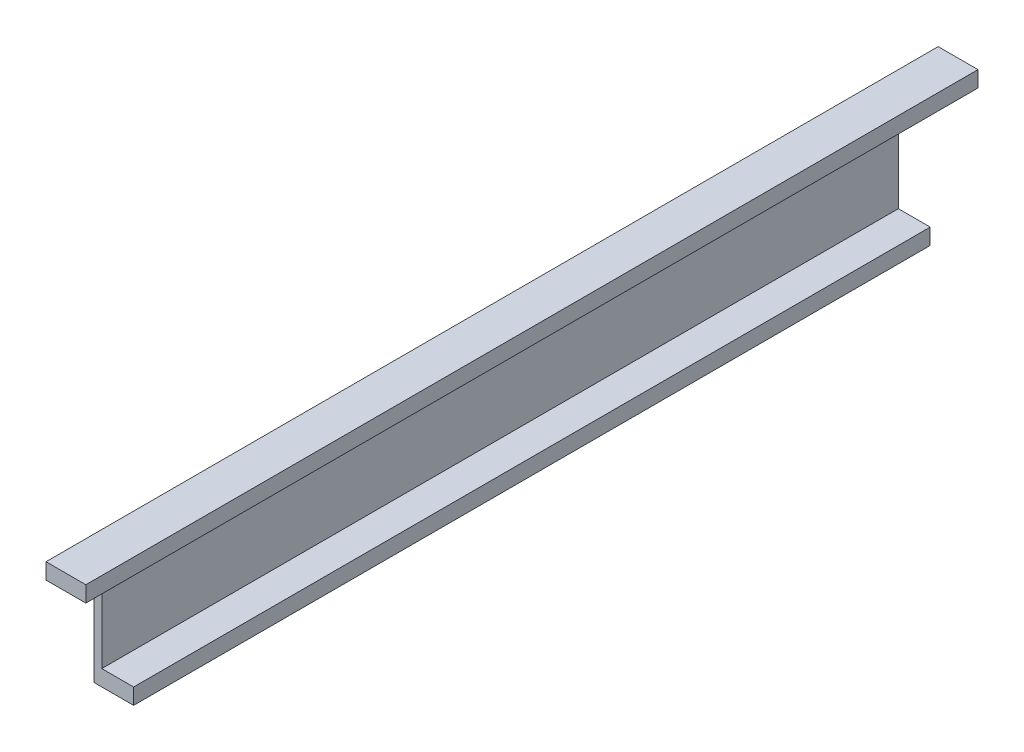
ISO-10303-21;
HEADER;
FILE_DESCRIPTION(('STEP AP214'),'2;1');
FILE_NAME('part.step','',(''),(''),'','','');
FILE_SCHEMA(('AUTOMOTIVE_DESIGN { 1 0 10303 214 1 1 1 1 }'));
ENDSEC;
DATA;
#1=APPLICATION_CONTEXT('core data for automotive mechanical design processes');
#2=APPLICATION_PROTOCOL_DEFINITION('international standard','automotive_design',2000,#1);
#3=PRODUCT_CONTEXT('',#1,'mechanical');
#4=PRODUCT('Part','Part','',(#3));
#5=PRODUCT_RELATED_PRODUCT_CATEGORY('part','',(#4));
#6=PRODUCT_DEFINITION_FORMATION('','',#4);
#7=PRODUCT_DEFINITION_CONTEXT('part definition',#1,'design');
#8=PRODUCT_DEFINITION('design','',#6,#7);
#9=PRODUCT_DEFINITION_SHAPE('','',#8);
#10=(LENGTH_UNIT() NAMED_UNIT(*) SI_UNIT(.MILLI.,.METRE.));
#11=(NAMED_UNIT(*) PLANE_ANGLE_UNIT() SI_UNIT($,.RADIAN.));
#12=(NAMED_UNIT(*) SI_UNIT($,.STERADIAN.) SOLID_ANGLE_UNIT());
#13=UNCERTAINTY_MEASURE_WITH_UNIT(LENGTH_MEASURE(1.E-05),#10,'distance_accuracy_value','');
#14=(GEOMETRIC_REPRESENTATION_CONTEXT(3) GLOBAL_UNCERTAINTY_ASSIGNED_CONTEXT((#13)) GLOBAL_UNIT_ASSIGNED_CONTEXT((#10,
#11,#12)) REPRESENTATION_CONTEXT('',''));
#15=CARTESIAN_POINT('',(0.,0.,0.));
#16=DIRECTION('',(0.,0.,1.));
#17=DIRECTION('',(1.,0.,0.));
#18=AXIS2_PLACEMENT_3D('',#15,#16,#17);
#19=CARTESIAN_POINT('',(1.25,-2.49999999999998,-125.));
#20=DIRECTION('',(0.,1.,0.));
#21=DIRECTION('',(0.,0.,1.));
#22=AXIS2_PLACEMENT_3D('',#19,#20,#21);
#23=PLANE('',#22);
#24=DIRECTION('',(-1.,0.,0.));
#25=VECTOR('',#24,1.);
#26=CARTESIAN_POINT('',(1.25,-2.49999999999998,-125.));
#27=LINE('',#26,#25);
#28=CARTESIAN_POINT('',(8.75,-2.49999999999998,-125.));
#29=VERTEX_POINT('',#28);
#30=CARTESIAN_POINT('',(-3.75,-2.49999999999998,-125.));
#31=VERTEX_POINT('',#30);
#32=EDGE_CURVE('E56',#29,#31,#27,.T.);
#33=ORIENTED_EDGE('',*,*,#32,.F.);
#34=DIRECTION('',(0.,0.,-1.));
#35=VECTOR('',#34,1.);
#36=CARTESIAN_POINT('',(8.75,-2.50000000000002,125.));
#37=LINE('',#36,#35);
#38=CARTESIAN_POINT('',(8.75,-2.50000000000002,125.));
#39=VERTEX_POINT('',#38);
#40=EDGE_CURVE('E148',#39,#29,#37,.T.);
#41=ORIENTED_EDGE('',*,*,#40,.F.);
#42=DIRECTION('',(1.,0.,0.));
#43=VECTOR('',#42,1.);
#44=CARTESIAN_POINT('',(-3.75,-2.49999999999998,125.));
#45=LINE('',#44,#43);
#46=CARTESIAN_POINT('',(-3.75,-2.49999999999998,125.));
#47=VERTEX_POINT('',#46);
#48=EDGE_CURVE('E189',#47,#39,#45,.T.);
#49=ORIENTED_EDGE('',*,*,#48,.F.);
#50=DIRECTION('',(0.,0.,-1.));
#51=VECTOR('',#50,1.);
#52=CARTESIAN_POINT('',(-3.75,-2.49999999999998,75.0000000000001));
#53=LINE('',#52,#51);
#54=EDGE_CURVE('E198',#47,#31,#53,.T.);
#55=ORIENTED_EDGE('',*,*,#54,.T.);
#56=EDGE_LOOP('',(#33,#41,#49,#55));
#57=FACE_BOUND('',#56,.T.);
#58=ADVANCED_FACE('F49',(#57),#23,.F.);
#59=CARTESIAN_POINT('',(1.25,2.50000000000002,-125.));
#60=DIRECTION('',(0.,-1.,0.));
#61=DIRECTION('',(0.,0.,-1.));
#62=AXIS2_PLACEMENT_3D('',#59,#60,#61);
#63=PLANE('',#62);
#64=DIRECTION('',(0.,0.,1.));
#65=VECTOR('',#64,1.);
#66=CARTESIAN_POINT('',(-1.25,2.50000000000002,-125.));
#67=LINE('',#66,#65);
#68=CARTESIAN_POINT('',(-1.25,2.50000000000002,-125.));
#69=VERTEX_POINT('',#68);
#70=CARTESIAN_POINT('',(-1.25,2.49999999999999,125.));
#71=VERTEX_POINT('',#70);
#72=EDGE_CURVE('E69',#69,#71,#67,.T.);
#73=ORIENTED_EDGE('',*,*,#72,.T.);
#74=DIRECTION('',(-1.,0.,0.));
#75=VECTOR('',#74,1.);
#76=CARTESIAN_POINT('',(1.25,2.49999999999999,125.));
#77=LINE('',#76,#75);
#78=CARTESIAN_POINT('',(8.75,2.49999999999999,125.));
#79=VERTEX_POINT('',#78);
#80=EDGE_CURVE('E139',#79,#71,#77,.T.);
#81=ORIENTED_EDGE('',*,*,#80,.F.);
#82=DIRECTION('',(0.,0.,1.));
#83=VECTOR('',#82,1.);
#84=CARTESIAN_POINT('',(8.75,2.50000000000002,-125.));
#85=LINE('',#84,#83);
#86=CARTESIAN_POINT('',(8.75,2.50000000000002,-125.));
#87=VERTEX_POINT('',#86);
#88=EDGE_CURVE('E136',#87,#79,#85,.T.);
#89=ORIENTED_EDGE('',*,*,#88,.F.);
#90=DIRECTION('',(-1.,0.,0.));
#91=VECTOR('',#90,1.);
#92=CARTESIAN_POINT('',(1.25,2.50000000000002,-125.));
#93=LINE('',#92,#91);
#94=EDGE_CURVE('E125',#87,#69,#93,.T.);
#95=ORIENTED_EDGE('',*,*,#94,.T.);
#96=EDGE_LOOP('',(#73,#81,#89,#95));
#97=FACE_BOUND('',#96,.T.);
#98=ADVANCED_FACE('F137',(#97),#63,.F.);
#99=CARTESIAN_POINT('',(1.25,-2.49999999999998,-125.));
#100=DIRECTION('',(0.,0.,1.));
#101=DIRECTION('',(1.,0.,0.));
#102=AXIS2_PLACEMENT_3D('',#99,#100,#101);
#103=PLANE('',#102);
#104=DIRECTION('',(0.,-1.,0.));
#105=VECTOR('',#104,1.);
#106=CARTESIAN_POINT('',(-3.75,0.,-125.));
#107=LINE('',#106,#105);
#108=CARTESIAN_POINT('',(-3.75,32.8,-125.));
#109=VERTEX_POINT('',#108);
#110=EDGE_CURVE('E194',#109,#31,#107,.T.);
#111=ORIENTED_EDGE('',*,*,#110,.F.);
#112=DIRECTION('',(1.,0.,0.));
#113=VECTOR('',#112,1.);
#114=CARTESIAN_POINT('',(1.25,32.8,-125.));
#115=LINE('',#114,#113);
#116=CARTESIAN_POINT('',(-1.25,32.8,-125.));
#117=VERTEX_POINT('',#116);
#118=EDGE_CURVE('E185',#109,#117,#115,.T.);
#119=ORIENTED_EDGE('',*,*,#118,.T.);
#120=DIRECTION('',(0.,1.,0.));
#121=VECTOR('',#120,1.);
#122=CARTESIAN_POINT('',(-1.25,0.,-125.));
#123=LINE('',#122,#121);
#124=EDGE_CURVE('E132',#69,#117,#123,.T.);
#125=ORIENTED_EDGE('',*,*,#124,.F.);
#126=ORIENTED_EDGE('',*,*,#94,.F.);
#127=DIRECTION('',(0.,1.,0.));
#128=VECTOR('',#127,1.);
#129=CARTESIAN_POINT('',(8.75,-2.49999999999998,-125.));
#130=LINE('',#129,#128);
#131=EDGE_CURVE('E131',#29,#87,#130,.T.);
#132=ORIENTED_EDGE('',*,*,#131,.F.);
#133=ORIENTED_EDGE('',*,*,#32,.T.);
#134=EDGE_LOOP('',(#111,#119,#125,#126,#132,#133));
#135=FACE_BOUND('',#134,.T.);
#136=ADVANCED_FACE('F128',(#135),#103,.F.);
#137=CARTESIAN_POINT('',(-1.25,0.,75.0000000000001));
#138=DIRECTION('',(-1.,0.,0.));
#139=DIRECTION('',(0.,0.,1.));
#140=AXIS2_PLACEMENT_3D('',#137,#138,#139);
#141=PLANE('',#140);
#142=DIRECTION('',(0.,0.,-1.));
#143=VECTOR('',#142,1.);
#144=CARTESIAN_POINT('',(-1.25,32.8,75.0000000000001));
#145=LINE('',#144,#143);
#146=CARTESIAN_POINT('',(-1.25,32.8,125.));
#147=VERTEX_POINT('',#146);
#148=EDGE_CURVE('E201',#147,#117,#145,.T.);
#149=ORIENTED_EDGE('',*,*,#148,.F.);
#150=DIRECTION('',(0.,1.,0.));
#151=VECTOR('',#150,1.);
#152=CARTESIAN_POINT('',(-1.25,2.49999999999999,125.));
#153=LINE('',#152,#151);
#154=EDGE_CURVE('E192',#71,#147,#153,.T.);
#155=ORIENTED_EDGE('',*,*,#154,.F.);
#156=ORIENTED_EDGE('',*,*,#72,.F.);
#157=ORIENTED_EDGE('',*,*,#124,.T.);
#158=EDGE_LOOP('',(#149,#155,#156,#157));
#159=FACE_BOUND('',#158,.T.);
#160=ADVANCED_FACE('F229',(#159),#141,.F.);
#161=CARTESIAN_POINT('',(-3.75,0.,75.0000000000001));
#162=DIRECTION('',(1.,0.,0.));
#163=DIRECTION('',(0.,1.,0.));
#164=AXIS2_PLACEMENT_3D('',#161,#162,#163);
#165=PLANE('',#164);
#166=DIRECTION('',(0.,-1.,0.));
#167=VECTOR('',#166,1.);
#168=CARTESIAN_POINT('',(-3.74999999999999,37.8,125.));
#169=LINE('',#168,#167);
#170=CARTESIAN_POINT('',(-3.75,32.8,125.));
#171=VERTEX_POINT('',#170);
#172=EDGE_CURVE('E187',#171,#47,#169,.T.);
#173=ORIENTED_EDGE('',*,*,#172,.F.);
#174=DIRECTION('',(0.,0.,1.));
#175=VECTOR('',#174,1.);
#176=CARTESIAN_POINT('',(-3.75,32.8,-140.));
#177=LINE('',#176,#175);
#178=CARTESIAN_POINT('',(-3.75,32.8,140.));
#179=VERTEX_POINT('',#178);
#180=EDGE_CURVE('E181',#171,#179,#177,.T.);
#181=ORIENTED_EDGE('',*,*,#180,.T.);
#182=DIRECTION('',(0.,-1.,0.));
#183=VECTOR('',#182,1.);
#184=CARTESIAN_POINT('',(-3.74999999999999,37.8,140.));
#185=LINE('',#184,#183);
#186=CARTESIAN_POINT('',(-3.74999999999999,37.8,140.));
#187=VERTEX_POINT('',#186);
#188=EDGE_CURVE('E170',#187,#179,#185,.T.);
#189=ORIENTED_EDGE('',*,*,#188,.F.);
#190=DIRECTION('',(0.,0.,-1.));
#191=VECTOR('',#190,1.);
#192=CARTESIAN_POINT('',(-3.74999999999999,37.8,75.0000000000001));
#193=LINE('',#192,#191);
#194=CARTESIAN_POINT('',(-3.74999999999999,37.8,-140.));
#195=VERTEX_POINT('',#194);
#196=EDGE_CURVE('E197',#187,#195,#193,.T.);
#197=ORIENTED_EDGE('',*,*,#196,.T.);
#198=DIRECTION('',(0.,-1.,0.));
#199=VECTOR('',#198,1.);
#200=CARTESIAN_POINT('',(-3.74999999999999,37.8,-140.));
#201=LINE('',#200,#199);
#202=CARTESIAN_POINT('',(-3.75,32.8,-140.));
#203=VERTEX_POINT('',#202);
#204=EDGE_CURVE('E178',#195,#203,#201,.T.);
#205=ORIENTED_EDGE('',*,*,#204,.T.);
#206=EDGE_CURVE('E182',#203,#109,#177,.T.);
#207=ORIENTED_EDGE('',*,*,#206,.T.);
#208=ORIENTED_EDGE('',*,*,#110,.T.);
#209=ORIENTED_EDGE('',*,*,#54,.F.);
#210=EDGE_LOOP('',(#173,#181,#189,#197,#205,#207,#208,#209));
#211=FACE_BOUND('',#210,.T.);
#212=ADVANCED_FACE('F209',(#211),#165,.F.);
#213=CARTESIAN_POINT('',(0.,32.8,75.0000000000001));
#214=DIRECTION('',(0.,1.,0.));
#215=DIRECTION('',(0.,0.,1.));
#216=AXIS2_PLACEMENT_3D('',#213,#214,#215);
#217=PLANE('',#216);
#218=ORIENTED_EDGE('',*,*,#148,.T.);
#219=ORIENTED_EDGE('',*,*,#118,.F.);
#220=ORIENTED_EDGE('',*,*,#206,.F.);
#221=DIRECTION('',(1.,0.,0.));
#222=VECTOR('',#221,1.);
#223=CARTESIAN_POINT('',(-1.25,32.8,-140.));
#224=LINE('',#223,#222);
#225=CARTESIAN_POINT('',(8.75,32.8,-140.));
#226=VERTEX_POINT('',#225);
#227=EDGE_CURVE('E173',#203,#226,#224,.T.);
#228=ORIENTED_EDGE('',*,*,#227,.T.);
#229=DIRECTION('',(0.,0.,-1.));
#230=VECTOR('',#229,1.);
#231=CARTESIAN_POINT('',(8.75,32.8,140.));
#232=LINE('',#231,#230);
#233=CARTESIAN_POINT('',(8.75,32.8,140.));
#234=VERTEX_POINT('',#233);
#235=EDGE_CURVE('E152',#234,#226,#232,.T.);
#236=ORIENTED_EDGE('',*,*,#235,.F.);
#237=DIRECTION('',(1.,0.,0.));
#238=VECTOR('',#237,1.);
#239=CARTESIAN_POINT('',(-1.25,32.8,140.));
#240=LINE('',#239,#238);
#241=EDGE_CURVE('E157',#179,#234,#240,.T.);
#242=ORIENTED_EDGE('',*,*,#241,.F.);
#243=ORIENTED_EDGE('',*,*,#180,.F.);
#244=DIRECTION('',(1.,0.,0.));
#245=VECTOR('',#244,1.);
#246=CARTESIAN_POINT('',(0.,32.8,125.));
#247=LINE('',#246,#245);
#248=EDGE_CURVE('E11',#171,#147,#247,.T.);
#249=ORIENTED_EDGE('',*,*,#248,.T.);
#250=EDGE_LOOP('',(#218,#219,#220,#228,#236,#242,#243,#249));
#251=FACE_BOUND('',#250,.T.);
#252=ADVANCED_FACE('F214',(#251),#217,.F.);
#253=CARTESIAN_POINT('',(0.,37.8,75.0000000000001));
#254=DIRECTION('',(0.,-1.,0.));
#255=DIRECTION('',(0.,0.,-1.));
#256=AXIS2_PLACEMENT_3D('',#253,#254,#255);
#257=PLANE('',#256);
#258=DIRECTION('',(-1.,0.,0.));
#259=VECTOR('',#258,1.);
#260=CARTESIAN_POINT('',(1.25,37.8,140.));
#261=LINE('',#260,#259);
#262=CARTESIAN_POINT('',(8.75,37.8,140.));
#263=VERTEX_POINT('',#262);
#264=EDGE_CURVE('E167',#263,#187,#261,.T.);
#265=ORIENTED_EDGE('',*,*,#264,.F.);
#266=DIRECTION('',(0.,0.,1.));
#267=VECTOR('',#266,1.);
#268=CARTESIAN_POINT('',(8.75,37.8,-140.));
#269=LINE('',#268,#267);
#270=CARTESIAN_POINT('',(8.75,37.8,-140.));
#271=VERTEX_POINT('',#270);
#272=EDGE_CURVE('E158',#271,#263,#269,.T.);
#273=ORIENTED_EDGE('',*,*,#272,.F.);
#274=DIRECTION('',(-1.,0.,0.));
#275=VECTOR('',#274,1.);
#276=CARTESIAN_POINT('',(1.25,37.8,-140.));
#277=LINE('',#276,#275);
#278=EDGE_CURVE('E175',#271,#195,#277,.T.);
#279=ORIENTED_EDGE('',*,*,#278,.T.);
#280=ORIENTED_EDGE('',*,*,#196,.F.);
#281=EDGE_LOOP('',(#265,#273,#279,#280));
#282=FACE_BOUND('',#281,.T.);
#283=ADVANCED_FACE('F224',(#282),#257,.F.);
#284=CARTESIAN_POINT('',(0.,0.,125.));
#285=DIRECTION('',(0.,0.,1.));
#286=DIRECTION('',(1.,0.,0.));
#287=AXIS2_PLACEMENT_3D('',#284,#285,#286);
#288=PLANE('',#287);
#289=ORIENTED_EDGE('',*,*,#248,.F.);
#290=ORIENTED_EDGE('',*,*,#172,.T.);
#291=ORIENTED_EDGE('',*,*,#48,.T.);
#292=DIRECTION('',(0.,-1.,0.));
#293=VECTOR('',#292,1.);
#294=CARTESIAN_POINT('',(8.75,2.49999999999999,125.));
#295=LINE('',#294,#293);
#296=EDGE_CURVE('E143',#79,#39,#295,.T.);
#297=ORIENTED_EDGE('',*,*,#296,.F.);
#298=ORIENTED_EDGE('',*,*,#80,.T.);
#299=ORIENTED_EDGE('',*,*,#154,.T.);
#300=EDGE_LOOP('',(#289,#290,#291,#297,#298,#299));
#301=FACE_BOUND('',#300,.T.);
#302=ADVANCED_FACE('F230',(#301),#288,.T.);
#303=CARTESIAN_POINT('',(0.,0.,140.));
#304=DIRECTION('',(0.,0.,1.));
#305=DIRECTION('',(1.,0.,0.));
#306=AXIS2_PLACEMENT_3D('',#303,#304,#305);
#307=PLANE('',#306);
#308=ORIENTED_EDGE('',*,*,#241,.T.);
#309=DIRECTION('',(0.,-1.,0.));
#310=VECTOR('',#309,1.);
#311=CARTESIAN_POINT('',(8.75,37.8,140.));
#312=LINE('',#311,#310);
#313=EDGE_CURVE('E149',#263,#234,#312,.T.);
#314=ORIENTED_EDGE('',*,*,#313,.F.);
#315=ORIENTED_EDGE('',*,*,#264,.T.);
#316=ORIENTED_EDGE('',*,*,#188,.T.);
#317=EDGE_LOOP('',(#308,#314,#315,#316));
#318=FACE_BOUND('',#317,.T.);
#319=ADVANCED_FACE('F227',(#318),#307,.T.);
#320=CARTESIAN_POINT('',(0.,0.,-140.));
#321=DIRECTION('',(0.,0.,1.));
#322=DIRECTION('',(1.,0.,0.));
#323=AXIS2_PLACEMENT_3D('',#320,#321,#322);
#324=PLANE('',#323);
#325=ORIENTED_EDGE('',*,*,#227,.F.);
#326=ORIENTED_EDGE('',*,*,#204,.F.);
#327=ORIENTED_EDGE('',*,*,#278,.F.);
#328=DIRECTION('',(0.,1.,0.));
#329=VECTOR('',#328,1.);
#330=CARTESIAN_POINT('',(8.75,32.8,-140.));
#331=LINE('',#330,#329);
#332=EDGE_CURVE('E161',#226,#271,#331,.T.);
#333=ORIENTED_EDGE('',*,*,#332,.F.);
#334=EDGE_LOOP('',(#325,#326,#327,#333));
#335=FACE_BOUND('',#334,.T.);
#336=ADVANCED_FACE('F218',(#335),#324,.F.);
#337=CARTESIAN_POINT('',(8.75,0.,0.));
#338=DIRECTION('',(1.,0.,0.));
#339=DIRECTION('',(0.,0.,-1.));
#340=AXIS2_PLACEMENT_3D('',#337,#338,#339);
#341=PLANE('',#340);
#342=ORIENTED_EDGE('',*,*,#313,.T.);
#343=ORIENTED_EDGE('',*,*,#235,.T.);
#344=ORIENTED_EDGE('',*,*,#332,.T.);
#345=ORIENTED_EDGE('',*,*,#272,.T.);
#346=EDGE_LOOP('',(#342,#343,#344,#345));
#347=FACE_BOUND('',#346,.T.);
#348=ADVANCED_FACE('F221',(#347),#341,.T.);
#349=CARTESIAN_POINT('',(8.75,0.,0.));
#350=DIRECTION('',(1.,0.,0.));
#351=DIRECTION('',(0.,0.,-1.));
#352=AXIS2_PLACEMENT_3D('',#349,#350,#351);
#353=PLANE('',#352);
#354=ORIENTED_EDGE('',*,*,#131,.T.);
#355=ORIENTED_EDGE('',*,*,#88,.T.);
#356=ORIENTED_EDGE('',*,*,#296,.T.);
#357=ORIENTED_EDGE('',*,*,#40,.T.);
#358=EDGE_LOOP('',(#354,#355,#356,#357));
#359=FACE_BOUND('',#358,.T.);
#360=ADVANCED_FACE('F146',(#359),#353,.T.);
#361=CLOSED_SHELL('',(#58,#98,#136,#160,#212,#252,#283,#302,#319,#336,#348,#360));
#362=MANIFOLD_SOLID_BREP('B2',#361);
#363=ADVANCED_BREP_SHAPE_REPRESENTATION('',(#18,#362),#14);
#364=SHAPE_DEFINITION_REPRESENTATION(#9,#363);
ENDSEC;
END-ISO-10303-21;
